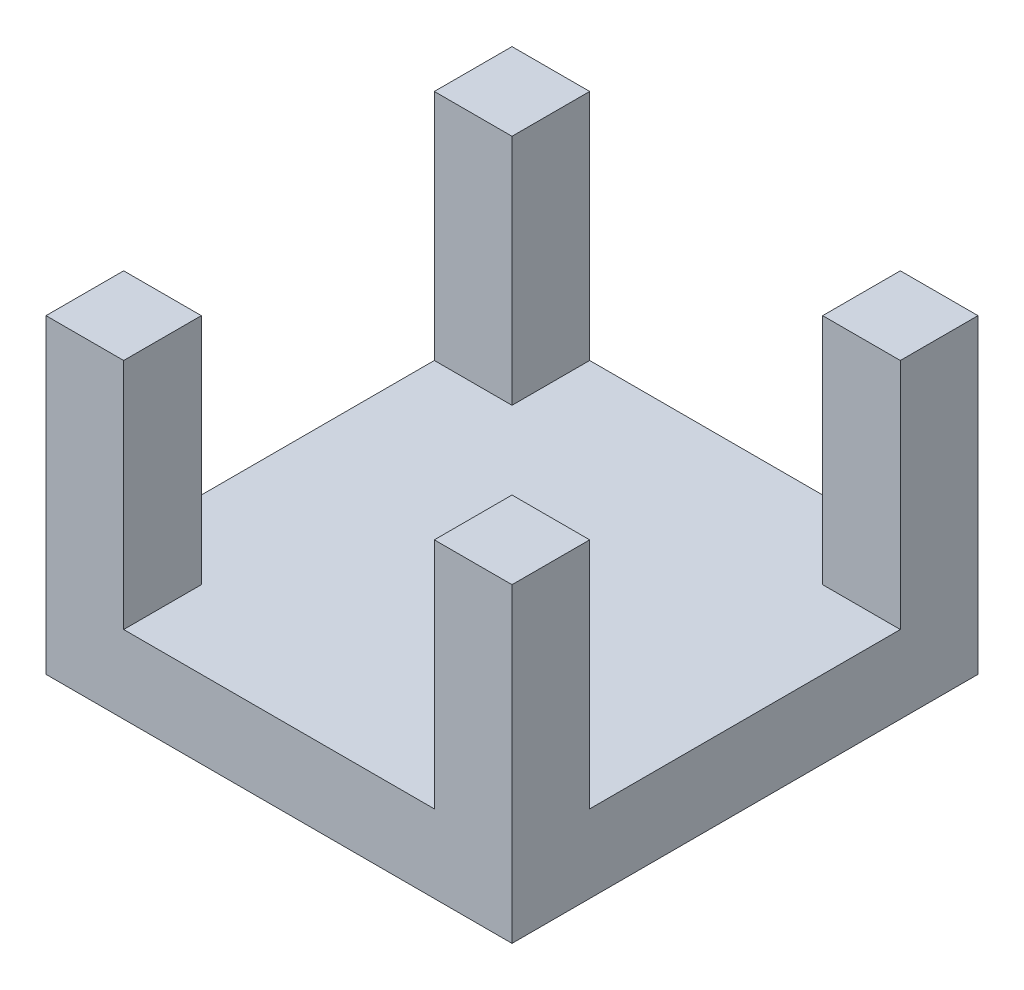
ISO-10303-21;
HEADER;
FILE_DESCRIPTION(('STEP AP214'),'2;1');
FILE_NAME('part.step','',(''),(''),'','','');
FILE_SCHEMA(('AUTOMOTIVE_DESIGN { 1 0 10303 214 1 1 1 1 }'));
ENDSEC;
DATA;
#1=APPLICATION_CONTEXT('core data for automotive mechanical design processes');
#2=APPLICATION_PROTOCOL_DEFINITION('international standard','automotive_design',2000,#1);
#3=PRODUCT_CONTEXT('',#1,'mechanical');
#4=PRODUCT('Part','Part','',(#3));
#5=PRODUCT_RELATED_PRODUCT_CATEGORY('part','',(#4));
#6=PRODUCT_DEFINITION_FORMATION('','',#4);
#7=PRODUCT_DEFINITION_CONTEXT('part definition',#1,'design');
#8=PRODUCT_DEFINITION('design','',#6,#7);
#9=PRODUCT_DEFINITION_SHAPE('','',#8);
#10=(LENGTH_UNIT() NAMED_UNIT(*) SI_UNIT(.MILLI.,.METRE.));
#11=(NAMED_UNIT(*) PLANE_ANGLE_UNIT() SI_UNIT($,.RADIAN.));
#12=(NAMED_UNIT(*) SI_UNIT($,.STERADIAN.) SOLID_ANGLE_UNIT());
#13=UNCERTAINTY_MEASURE_WITH_UNIT(LENGTH_MEASURE(1.E-05),#10,'distance_accuracy_value','');
#14=(GEOMETRIC_REPRESENTATION_CONTEXT(3) GLOBAL_UNCERTAINTY_ASSIGNED_CONTEXT((#13)) GLOBAL_UNIT_ASSIGNED_CONTEXT((#10,
#11,#12)) REPRESENTATION_CONTEXT('',''));
#15=CARTESIAN_POINT('',(0.,0.,0.));
#16=DIRECTION('',(0.,0.,1.));
#17=DIRECTION('',(1.,0.,0.));
#18=AXIS2_PLACEMENT_3D('',#15,#16,#17);
#19=CARTESIAN_POINT('',(0.,400.,0.));
#20=DIRECTION('',(0.,1.,0.));
#21=DIRECTION('',(0.,0.,1.));
#22=AXIS2_PLACEMENT_3D('',#19,#20,#21);
#23=PLANE('',#22);
#24=DIRECTION('',(-1.,0.,0.));
#25=VECTOR('',#24,1.);
#26=CARTESIAN_POINT('',(-500.,400.,-200.));
#27=LINE('',#26,#25);
#28=CARTESIAN_POINT('',(-200.,400.,-200.));
#29=VERTEX_POINT('',#28);
#30=CARTESIAN_POINT('',(-300.,400.,-200.));
#31=VERTEX_POINT('',#30);
#32=EDGE_CURVE('E181',#29,#31,#27,.T.);
#33=ORIENTED_EDGE('',*,*,#32,.F.);
#34=DIRECTION('',(0.,0.,1.));
#35=VECTOR('',#34,1.);
#36=CARTESIAN_POINT('',(-200.,400.,0.));
#37=LINE('',#36,#35);
#38=CARTESIAN_POINT('',(-200.,400.,-300.));
#39=VERTEX_POINT('',#38);
#40=EDGE_CURVE('E328',#39,#29,#37,.T.);
#41=ORIENTED_EDGE('',*,*,#40,.F.);
#42=DIRECTION('',(-1.,0.,0.));
#43=VECTOR('',#42,1.);
#44=CARTESIAN_POINT('',(-300.,400.,-300.));
#45=LINE('',#44,#43);
#46=CARTESIAN_POINT('',(-300.,400.,-300.));
#47=VERTEX_POINT('',#46);
#48=EDGE_CURVE('E70',#39,#47,#45,.T.);
#49=ORIENTED_EDGE('',*,*,#48,.T.);
#50=DIRECTION('',(0.,0.,1.));
#51=VECTOR('',#50,1.);
#52=CARTESIAN_POINT('',(-300.,400.,-300.));
#53=LINE('',#52,#51);
#54=EDGE_CURVE('E280',#47,#31,#53,.T.);
#55=ORIENTED_EDGE('',*,*,#54,.T.);
#56=EDGE_LOOP('',(#33,#41,#49,#55));
#57=FACE_BOUND('',#56,.T.);
#58=ADVANCED_FACE('F45',(#57),#23,.T.);
#59=DIRECTION('',(0.,0.,-1.));
#60=VECTOR('',#59,1.);
#61=CARTESIAN_POINT('',(200.,400.,-500.));
#62=LINE('',#61,#60);
#63=CARTESIAN_POINT('',(200.,400.,-200.));
#64=VERTEX_POINT('',#63);
#65=CARTESIAN_POINT('',(200.,400.,-300.));
#66=VERTEX_POINT('',#65);
#67=EDGE_CURVE('E227',#64,#66,#62,.T.);
#68=ORIENTED_EDGE('',*,*,#67,.F.);
#69=DIRECTION('',(-1.,0.,0.));
#70=VECTOR('',#69,1.);
#71=CARTESIAN_POINT('',(0.,400.,-200.));
#72=LINE('',#71,#70);
#73=CARTESIAN_POINT('',(300.,400.,-200.));
#74=VERTEX_POINT('',#73);
#75=EDGE_CURVE('E325',#74,#64,#72,.T.);
#76=ORIENTED_EDGE('',*,*,#75,.F.);
#77=DIRECTION('',(0.,0.,-1.));
#78=VECTOR('',#77,1.);
#79=CARTESIAN_POINT('',(300.,400.,-300.));
#80=LINE('',#79,#78);
#81=CARTESIAN_POINT('',(300.,400.,-300.));
#82=VERTEX_POINT('',#81);
#83=EDGE_CURVE('E287',#74,#82,#80,.T.);
#84=ORIENTED_EDGE('',*,*,#83,.T.);
#85=EDGE_CURVE('E292',#82,#66,#45,.T.);
#86=ORIENTED_EDGE('',*,*,#85,.T.);
#87=EDGE_LOOP('',(#68,#76,#84,#86));
#88=FACE_BOUND('',#87,.T.);
#89=ADVANCED_FACE('F373',(#88),#23,.T.);
#90=DIRECTION('',(1.,0.,0.));
#91=VECTOR('',#90,1.);
#92=CARTESIAN_POINT('',(200.,400.,200.));
#93=LINE('',#92,#91);
#94=CARTESIAN_POINT('',(200.,400.,200.));
#95=VERTEX_POINT('',#94);
#96=CARTESIAN_POINT('',(300.,400.,200.));
#97=VERTEX_POINT('',#96);
#98=EDGE_CURVE('E223',#95,#97,#93,.T.);
#99=ORIENTED_EDGE('',*,*,#98,.F.);
#100=DIRECTION('',(0.,0.,-1.));
#101=VECTOR('',#100,1.);
#102=CARTESIAN_POINT('',(200.,400.,0.));
#103=LINE('',#102,#101);
#104=CARTESIAN_POINT('',(200.,400.,300.));
#105=VERTEX_POINT('',#104);
#106=EDGE_CURVE('E322',#105,#95,#103,.T.);
#107=ORIENTED_EDGE('',*,*,#106,.F.);
#108=DIRECTION('',(1.,0.,0.));
#109=VECTOR('',#108,1.);
#110=CARTESIAN_POINT('',(-300.,400.,300.));
#111=LINE('',#110,#109);
#112=CARTESIAN_POINT('',(300.,400.,300.));
#113=VERTEX_POINT('',#112);
#114=EDGE_CURVE('E283',#105,#113,#111,.T.);
#115=ORIENTED_EDGE('',*,*,#114,.T.);
#116=EDGE_CURVE('E288',#113,#97,#80,.T.);
#117=ORIENTED_EDGE('',*,*,#116,.T.);
#118=EDGE_LOOP('',(#99,#107,#115,#117));
#119=FACE_BOUND('',#118,.T.);
#120=ADVANCED_FACE('F378',(#119),#23,.T.);
#121=CARTESIAN_POINT('',(-300.,400.,-300.));
#122=DIRECTION('',(1.,0.,0.));
#123=DIRECTION('',(0.,0.,-1.));
#124=AXIS2_PLACEMENT_3D('',#121,#122,#123);
#125=PLANE('',#124);
#126=DIRECTION('',(0.,0.,1.));
#127=VECTOR('',#126,1.);
#128=CARTESIAN_POINT('',(-300.,100.,-300.));
#129=LINE('',#128,#127);
#130=CARTESIAN_POINT('',(-300.,100.,-200.));
#131=VERTEX_POINT('',#130);
#132=CARTESIAN_POINT('',(-300.,100.,200.));
#133=VERTEX_POINT('',#132);
#134=EDGE_CURVE('E179',#131,#133,#129,.T.);
#135=ORIENTED_EDGE('',*,*,#134,.F.);
#136=DIRECTION('',(0.,1.,0.));
#137=VECTOR('',#136,1.);
#138=CARTESIAN_POINT('',(-300.,400.,-200.));
#139=LINE('',#138,#137);
#140=EDGE_CURVE('E267',#131,#31,#139,.T.);
#141=ORIENTED_EDGE('',*,*,#140,.T.);
#142=ORIENTED_EDGE('',*,*,#54,.F.);
#143=DIRECTION('',(0.,-1.,0.));
#144=VECTOR('',#143,1.);
#145=CARTESIAN_POINT('',(-300.,400.,-300.));
#146=LINE('',#145,#144);
#147=CARTESIAN_POINT('',(-300.,0.,-300.));
#148=VERTEX_POINT('',#147);
#149=EDGE_CURVE('E296',#47,#148,#146,.T.);
#150=ORIENTED_EDGE('',*,*,#149,.T.);
#151=DIRECTION('',(0.,0.,1.));
#152=VECTOR('',#151,1.);
#153=CARTESIAN_POINT('',(-300.,0.,-300.));
#154=LINE('',#153,#152);
#155=CARTESIAN_POINT('',(-300.,0.,300.));
#156=VERTEX_POINT('',#155);
#157=EDGE_CURVE('E279',#148,#156,#154,.T.);
#158=ORIENTED_EDGE('',*,*,#157,.T.);
#159=DIRECTION('',(0.,-1.,0.));
#160=VECTOR('',#159,1.);
#161=CARTESIAN_POINT('',(-300.,400.,300.));
#162=LINE('',#161,#160);
#163=CARTESIAN_POINT('',(-300.,400.,300.));
#164=VERTEX_POINT('',#163);
#165=EDGE_CURVE('E316',#164,#156,#162,.T.);
#166=ORIENTED_EDGE('',*,*,#165,.F.);
#167=CARTESIAN_POINT('',(-300.,400.,200.));
#168=VERTEX_POINT('',#167);
#169=EDGE_CURVE('E99',#168,#164,#53,.T.);
#170=ORIENTED_EDGE('',*,*,#169,.F.);
#171=DIRECTION('',(0.,-1.,0.));
#172=VECTOR('',#171,1.);
#173=CARTESIAN_POINT('',(-300.,400.,200.));
#174=LINE('',#173,#172);
#175=EDGE_CURVE('E61',#168,#133,#174,.T.);
#176=ORIENTED_EDGE('',*,*,#175,.T.);
#177=EDGE_LOOP('',(#135,#141,#142,#150,#158,#166,#170,#176));
#178=FACE_BOUND('',#177,.T.);
#179=ADVANCED_FACE('F47',(#178),#125,.F.);
#180=CARTESIAN_POINT('',(-300.,400.,300.));
#181=DIRECTION('',(0.,0.,-1.));
#182=DIRECTION('',(-1.,0.,0.));
#183=AXIS2_PLACEMENT_3D('',#180,#181,#182);
#184=PLANE('',#183);
#185=ORIENTED_EDGE('',*,*,#114,.F.);
#186=DIRECTION('',(0.,-1.,0.));
#187=VECTOR('',#186,1.);
#188=CARTESIAN_POINT('',(200.,400.,300.));
#189=LINE('',#188,#187);
#190=CARTESIAN_POINT('',(200.,100.,300.));
#191=VERTEX_POINT('',#190);
#192=EDGE_CURVE('E247',#105,#191,#189,.T.);
#193=ORIENTED_EDGE('',*,*,#192,.T.);
#194=DIRECTION('',(1.,0.,0.));
#195=VECTOR('',#194,1.);
#196=CARTESIAN_POINT('',(-300.,100.,300.));
#197=LINE('',#196,#195);
#198=CARTESIAN_POINT('',(-200.,100.,300.));
#199=VERTEX_POINT('',#198);
#200=EDGE_CURVE('E274',#199,#191,#197,.T.);
#201=ORIENTED_EDGE('',*,*,#200,.F.);
#202=DIRECTION('',(0.,1.,0.));
#203=VECTOR('',#202,1.);
#204=CARTESIAN_POINT('',(-200.,400.,300.));
#205=LINE('',#204,#203);
#206=CARTESIAN_POINT('',(-200.,400.,300.));
#207=VERTEX_POINT('',#206);
#208=EDGE_CURVE('E195',#199,#207,#205,.T.);
#209=ORIENTED_EDGE('',*,*,#208,.T.);
#210=EDGE_CURVE('E284',#164,#207,#111,.T.);
#211=ORIENTED_EDGE('',*,*,#210,.F.);
#212=ORIENTED_EDGE('',*,*,#165,.T.);
#213=DIRECTION('',(1.,0.,0.));
#214=VECTOR('',#213,1.);
#215=CARTESIAN_POINT('',(-300.,0.,300.));
#216=LINE('',#215,#214);
#217=CARTESIAN_POINT('',(300.,0.,300.));
#218=VERTEX_POINT('',#217);
#219=EDGE_CURVE('E299',#156,#218,#216,.T.);
#220=ORIENTED_EDGE('',*,*,#219,.T.);
#221=DIRECTION('',(0.,-1.,0.));
#222=VECTOR('',#221,1.);
#223=CARTESIAN_POINT('',(300.,400.,300.));
#224=LINE('',#223,#222);
#225=EDGE_CURVE('E312',#113,#218,#224,.T.);
#226=ORIENTED_EDGE('',*,*,#225,.F.);
#227=EDGE_LOOP('',(#185,#193,#201,#209,#211,#212,#220,#226));
#228=FACE_BOUND('',#227,.T.);
#229=ADVANCED_FACE('F393',(#228),#184,.F.);
#230=CARTESIAN_POINT('',(300.,400.,-300.));
#231=DIRECTION('',(-1.,0.,0.));
#232=DIRECTION('',(0.,0.,1.));
#233=AXIS2_PLACEMENT_3D('',#230,#231,#232);
#234=PLANE('',#233);
#235=ORIENTED_EDGE('',*,*,#83,.F.);
#236=DIRECTION('',(0.,-1.,0.));
#237=VECTOR('',#236,1.);
#238=CARTESIAN_POINT('',(300.,400.,-200.));
#239=LINE('',#238,#237);
#240=CARTESIAN_POINT('',(300.,100.,-200.));
#241=VERTEX_POINT('',#240);
#242=EDGE_CURVE('E255',#74,#241,#239,.T.);
#243=ORIENTED_EDGE('',*,*,#242,.T.);
#244=DIRECTION('',(0.,0.,-1.));
#245=VECTOR('',#244,1.);
#246=CARTESIAN_POINT('',(300.,100.,-300.));
#247=LINE('',#246,#245);
#248=CARTESIAN_POINT('',(300.,100.,200.));
#249=VERTEX_POINT('',#248);
#250=EDGE_CURVE('E271',#249,#241,#247,.T.);
#251=ORIENTED_EDGE('',*,*,#250,.F.);
#252=DIRECTION('',(0.,1.,0.));
#253=VECTOR('',#252,1.);
#254=CARTESIAN_POINT('',(300.,400.,200.));
#255=LINE('',#254,#253);
#256=EDGE_CURVE('E251',#249,#97,#255,.T.);
#257=ORIENTED_EDGE('',*,*,#256,.T.);
#258=ORIENTED_EDGE('',*,*,#116,.F.);
#259=ORIENTED_EDGE('',*,*,#225,.T.);
#260=DIRECTION('',(0.,0.,-1.));
#261=VECTOR('',#260,1.);
#262=CARTESIAN_POINT('',(300.,0.,-300.));
#263=LINE('',#262,#261);
#264=CARTESIAN_POINT('',(300.,0.,-300.));
#265=VERTEX_POINT('',#264);
#266=EDGE_CURVE('E302',#218,#265,#263,.T.);
#267=ORIENTED_EDGE('',*,*,#266,.T.);
#268=DIRECTION('',(0.,-1.,0.));
#269=VECTOR('',#268,1.);
#270=CARTESIAN_POINT('',(300.,400.,-300.));
#271=LINE('',#270,#269);
#272=EDGE_CURVE('E309',#82,#265,#271,.T.);
#273=ORIENTED_EDGE('',*,*,#272,.F.);
#274=EDGE_LOOP('',(#235,#243,#251,#257,#258,#259,#267,#273));
#275=FACE_BOUND('',#274,.T.);
#276=ADVANCED_FACE('F387',(#275),#234,.F.);
#277=CARTESIAN_POINT('',(-300.,400.,-300.));
#278=DIRECTION('',(0.,0.,1.));
#279=DIRECTION('',(1.,0.,0.));
#280=AXIS2_PLACEMENT_3D('',#277,#278,#279);
#281=PLANE('',#280);
#282=ORIENTED_EDGE('',*,*,#48,.F.);
#283=DIRECTION('',(0.,-1.,0.));
#284=VECTOR('',#283,1.);
#285=CARTESIAN_POINT('',(-200.,400.,-300.));
#286=LINE('',#285,#284);
#287=CARTESIAN_POINT('',(-200.,100.,-300.));
#288=VERTEX_POINT('',#287);
#289=EDGE_CURVE('E263',#39,#288,#286,.T.);
#290=ORIENTED_EDGE('',*,*,#289,.T.);
#291=DIRECTION('',(-1.,0.,0.));
#292=VECTOR('',#291,1.);
#293=CARTESIAN_POINT('',(-300.,100.,-300.));
#294=LINE('',#293,#292);
#295=CARTESIAN_POINT('',(200.,100.,-300.));
#296=VERTEX_POINT('',#295);
#297=EDGE_CURVE('E54',#296,#288,#294,.T.);
#298=ORIENTED_EDGE('',*,*,#297,.F.);
#299=DIRECTION('',(0.,1.,0.));
#300=VECTOR('',#299,1.);
#301=CARTESIAN_POINT('',(200.,400.,-300.));
#302=LINE('',#301,#300);
#303=EDGE_CURVE('E259',#296,#66,#302,.T.);
#304=ORIENTED_EDGE('',*,*,#303,.T.);
#305=ORIENTED_EDGE('',*,*,#85,.F.);
#306=ORIENTED_EDGE('',*,*,#272,.T.);
#307=DIRECTION('',(-1.,0.,0.));
#308=VECTOR('',#307,1.);
#309=CARTESIAN_POINT('',(-300.,0.,-300.));
#310=LINE('',#309,#308);
#311=EDGE_CURVE('E92',#265,#148,#310,.T.);
#312=ORIENTED_EDGE('',*,*,#311,.T.);
#313=ORIENTED_EDGE('',*,*,#149,.F.);
#314=EDGE_LOOP('',(#282,#290,#298,#304,#305,#306,#312,#313));
#315=FACE_BOUND('',#314,.T.);
#316=ADVANCED_FACE('F339',(#315),#281,.F.);
#317=DIRECTION('',(0.,0.,1.));
#318=VECTOR('',#317,1.);
#319=CARTESIAN_POINT('',(-200.,400.,200.));
#320=LINE('',#319,#318);
#321=CARTESIAN_POINT('',(-200.,400.,200.));
#322=VERTEX_POINT('',#321);
#323=EDGE_CURVE('E220',#322,#207,#320,.T.);
#324=ORIENTED_EDGE('',*,*,#323,.F.);
#325=DIRECTION('',(1.,0.,0.));
#326=VECTOR('',#325,1.);
#327=CARTESIAN_POINT('',(0.,400.,200.));
#328=LINE('',#327,#326);
#329=EDGE_CURVE('E186',#168,#322,#328,.T.);
#330=ORIENTED_EDGE('',*,*,#329,.F.);
#331=ORIENTED_EDGE('',*,*,#169,.T.);
#332=ORIENTED_EDGE('',*,*,#210,.T.);
#333=EDGE_LOOP('',(#324,#330,#331,#332));
#334=FACE_BOUND('',#333,.T.);
#335=ADVANCED_FACE('F375',(#334),#23,.T.);
#336=CARTESIAN_POINT('',(0.,0.,0.));
#337=DIRECTION('',(0.,1.,0.));
#338=DIRECTION('',(0.,0.,1.));
#339=AXIS2_PLACEMENT_3D('',#336,#337,#338);
#340=PLANE('',#339);
#341=CARTESIAN_POINT('',(0.,0.,-200.));
#342=DIRECTION('',(0.,1.,0.));
#343=DIRECTION('',(0.,0.,1.));
#344=AXIS2_PLACEMENT_3D('',#341,#342,#343);
#345=CIRCLE('',#344,60.);
#346=CARTESIAN_POINT('',(0.,0.,-140.));
#347=VERTEX_POINT('',#346);
#348=EDGE_CURVE('E11',#347,#347,#345,.F.);
#349=ORIENTED_EDGE('',*,*,#348,.F.);
#350=EDGE_LOOP('',(#349));
#351=FACE_BOUND('',#350,.T.);
#352=ORIENTED_EDGE('',*,*,#157,.F.);
#353=ORIENTED_EDGE('',*,*,#311,.F.);
#354=ORIENTED_EDGE('',*,*,#266,.F.);
#355=ORIENTED_EDGE('',*,*,#219,.F.);
#356=EDGE_LOOP('',(#352,#353,#354,#355));
#357=FACE_BOUND('',#356,.T.);
#358=ADVANCED_FACE('F367',(#351,#357),#340,.F.);
#359=CARTESIAN_POINT('',(0.,100.,0.));
#360=DIRECTION('',(0.,1.,0.));
#361=DIRECTION('',(0.,0.,1.));
#362=AXIS2_PLACEMENT_3D('',#359,#360,#361);
#363=PLANE('',#362);
#364=ORIENTED_EDGE('',*,*,#134,.T.);
#365=DIRECTION('',(1.,0.,0.));
#366=VECTOR('',#365,1.);
#367=CARTESIAN_POINT('',(-500.,100.,200.));
#368=LINE('',#367,#366);
#369=CARTESIAN_POINT('',(-200.,100.,200.));
#370=VERTEX_POINT('',#369);
#371=EDGE_CURVE('E171',#133,#370,#368,.T.);
#372=ORIENTED_EDGE('',*,*,#371,.T.);
#373=DIRECTION('',(0.,0.,1.));
#374=VECTOR('',#373,1.);
#375=CARTESIAN_POINT('',(-200.,100.,200.));
#376=LINE('',#375,#374);
#377=EDGE_CURVE('E175',#370,#199,#376,.T.);
#378=ORIENTED_EDGE('',*,*,#377,.T.);
#379=ORIENTED_EDGE('',*,*,#200,.T.);
#380=DIRECTION('',(0.,0.,-1.));
#381=VECTOR('',#380,1.);
#382=CARTESIAN_POINT('',(200.,100.,200.));
#383=LINE('',#382,#381);
#384=CARTESIAN_POINT('',(200.,100.,200.));
#385=VERTEX_POINT('',#384);
#386=EDGE_CURVE('E197',#191,#385,#383,.T.);
#387=ORIENTED_EDGE('',*,*,#386,.T.);
#388=DIRECTION('',(1.,0.,0.));
#389=VECTOR('',#388,1.);
#390=CARTESIAN_POINT('',(200.,100.,200.));
#391=LINE('',#390,#389);
#392=EDGE_CURVE('E201',#385,#249,#391,.T.);
#393=ORIENTED_EDGE('',*,*,#392,.T.);
#394=ORIENTED_EDGE('',*,*,#250,.T.);
#395=DIRECTION('',(-1.,0.,0.));
#396=VECTOR('',#395,1.);
#397=CARTESIAN_POINT('',(200.,100.,-200.));
#398=LINE('',#397,#396);
#399=CARTESIAN_POINT('',(200.,100.,-200.));
#400=VERTEX_POINT('',#399);
#401=EDGE_CURVE('E208',#241,#400,#398,.T.);
#402=ORIENTED_EDGE('',*,*,#401,.T.);
#403=DIRECTION('',(0.,0.,-1.));
#404=VECTOR('',#403,1.);
#405=CARTESIAN_POINT('',(200.,100.,-500.));
#406=LINE('',#405,#404);
#407=EDGE_CURVE('E211',#400,#296,#406,.T.);
#408=ORIENTED_EDGE('',*,*,#407,.T.);
#409=ORIENTED_EDGE('',*,*,#297,.T.);
#410=DIRECTION('',(0.,0.,1.));
#411=VECTOR('',#410,1.);
#412=CARTESIAN_POINT('',(-200.,100.,-500.));
#413=LINE('',#412,#411);
#414=CARTESIAN_POINT('',(-200.,100.,-200.));
#415=VERTEX_POINT('',#414);
#416=EDGE_CURVE('E215',#288,#415,#413,.T.);
#417=ORIENTED_EDGE('',*,*,#416,.T.);
#418=DIRECTION('',(-1.,0.,0.));
#419=VECTOR('',#418,1.);
#420=CARTESIAN_POINT('',(-500.,100.,-200.));
#421=LINE('',#420,#419);
#422=EDGE_CURVE('E191',#415,#131,#421,.T.);
#423=ORIENTED_EDGE('',*,*,#422,.T.);
#424=EDGE_LOOP('',(#364,#372,#378,#379,#387,#393,#394,#402,#408,#409,#417,#423));
#425=FACE_BOUND('',#424,.T.);
#426=ADVANCED_FACE('F173',(#425),#363,.T.);
#427=CARTESIAN_POINT('',(-500.,100.,-200.));
#428=DIRECTION('',(0.,0.,-1.));
#429=DIRECTION('',(-1.,0.,0.));
#430=AXIS2_PLACEMENT_3D('',#427,#428,#429);
#431=PLANE('',#430);
#432=ORIENTED_EDGE('',*,*,#422,.F.);
#433=DIRECTION('',(0.,1.,0.));
#434=VECTOR('',#433,1.);
#435=CARTESIAN_POINT('',(-200.,100.,-200.));
#436=LINE('',#435,#434);
#437=EDGE_CURVE('E232',#415,#29,#436,.T.);
#438=ORIENTED_EDGE('',*,*,#437,.T.);
#439=ORIENTED_EDGE('',*,*,#32,.T.);
#440=ORIENTED_EDGE('',*,*,#140,.F.);
#441=EDGE_LOOP('',(#432,#438,#439,#440));
#442=FACE_BOUND('',#441,.T.);
#443=ADVANCED_FACE('F421',(#442),#431,.F.);
#444=CARTESIAN_POINT('',(-200.,100.,-500.));
#445=DIRECTION('',(-1.,0.,0.));
#446=DIRECTION('',(0.,0.,1.));
#447=AXIS2_PLACEMENT_3D('',#444,#445,#446);
#448=PLANE('',#447);
#449=ORIENTED_EDGE('',*,*,#40,.T.);
#450=ORIENTED_EDGE('',*,*,#437,.F.);
#451=ORIENTED_EDGE('',*,*,#416,.F.);
#452=ORIENTED_EDGE('',*,*,#289,.F.);
#453=EDGE_LOOP('',(#449,#450,#451,#452));
#454=FACE_BOUND('',#453,.T.);
#455=ADVANCED_FACE('F337',(#454),#448,.F.);
#456=CARTESIAN_POINT('',(200.,100.,-500.));
#457=DIRECTION('',(1.,0.,0.));
#458=DIRECTION('',(0.,0.,-1.));
#459=AXIS2_PLACEMENT_3D('',#456,#457,#458);
#460=PLANE('',#459);
#461=ORIENTED_EDGE('',*,*,#407,.F.);
#462=DIRECTION('',(0.,1.,0.));
#463=VECTOR('',#462,1.);
#464=CARTESIAN_POINT('',(200.,100.,-200.));
#465=LINE('',#464,#463);
#466=EDGE_CURVE('E236',#400,#64,#465,.T.);
#467=ORIENTED_EDGE('',*,*,#466,.T.);
#468=ORIENTED_EDGE('',*,*,#67,.T.);
#469=ORIENTED_EDGE('',*,*,#303,.F.);
#470=EDGE_LOOP('',(#461,#467,#468,#469));
#471=FACE_BOUND('',#470,.T.);
#472=ADVANCED_FACE('F413',(#471),#460,.F.);
#473=CARTESIAN_POINT('',(200.,100.,-200.));
#474=DIRECTION('',(0.,0.,-1.));
#475=DIRECTION('',(-1.,0.,0.));
#476=AXIS2_PLACEMENT_3D('',#473,#474,#475);
#477=PLANE('',#476);
#478=ORIENTED_EDGE('',*,*,#75,.T.);
#479=ORIENTED_EDGE('',*,*,#466,.F.);
#480=ORIENTED_EDGE('',*,*,#401,.F.);
#481=ORIENTED_EDGE('',*,*,#242,.F.);
#482=EDGE_LOOP('',(#478,#479,#480,#481));
#483=FACE_BOUND('',#482,.T.);
#484=ADVANCED_FACE('F409',(#483),#477,.F.);
#485=CARTESIAN_POINT('',(200.,100.,200.));
#486=DIRECTION('',(0.,0.,1.));
#487=DIRECTION('',(1.,0.,0.));
#488=AXIS2_PLACEMENT_3D('',#485,#486,#487);
#489=PLANE('',#488);
#490=ORIENTED_EDGE('',*,*,#392,.F.);
#491=DIRECTION('',(0.,1.,0.));
#492=VECTOR('',#491,1.);
#493=CARTESIAN_POINT('',(200.,100.,200.));
#494=LINE('',#493,#492);
#495=EDGE_CURVE('E190',#385,#95,#494,.T.);
#496=ORIENTED_EDGE('',*,*,#495,.T.);
#497=ORIENTED_EDGE('',*,*,#98,.T.);
#498=ORIENTED_EDGE('',*,*,#256,.F.);
#499=EDGE_LOOP('',(#490,#496,#497,#498));
#500=FACE_BOUND('',#499,.T.);
#501=ADVANCED_FACE('F401',(#500),#489,.F.);
#502=CARTESIAN_POINT('',(200.,100.,200.));
#503=DIRECTION('',(1.,0.,0.));
#504=DIRECTION('',(0.,0.,-1.));
#505=AXIS2_PLACEMENT_3D('',#502,#503,#504);
#506=PLANE('',#505);
#507=ORIENTED_EDGE('',*,*,#106,.T.);
#508=ORIENTED_EDGE('',*,*,#495,.F.);
#509=ORIENTED_EDGE('',*,*,#386,.F.);
#510=ORIENTED_EDGE('',*,*,#192,.F.);
#511=EDGE_LOOP('',(#507,#508,#509,#510));
#512=FACE_BOUND('',#511,.T.);
#513=ADVANCED_FACE('F437',(#512),#506,.F.);
#514=CARTESIAN_POINT('',(-200.,100.,200.));
#515=DIRECTION('',(-1.,0.,0.));
#516=DIRECTION('',(0.,0.,1.));
#517=AXIS2_PLACEMENT_3D('',#514,#515,#516);
#518=PLANE('',#517);
#519=ORIENTED_EDGE('',*,*,#377,.F.);
#520=DIRECTION('',(0.,1.,0.));
#521=VECTOR('',#520,1.);
#522=CARTESIAN_POINT('',(-200.,100.,200.));
#523=LINE('',#522,#521);
#524=EDGE_CURVE('E184',#370,#322,#523,.T.);
#525=ORIENTED_EDGE('',*,*,#524,.T.);
#526=ORIENTED_EDGE('',*,*,#323,.T.);
#527=ORIENTED_EDGE('',*,*,#208,.F.);
#528=EDGE_LOOP('',(#519,#525,#526,#527));
#529=FACE_BOUND('',#528,.T.);
#530=ADVANCED_FACE('F193',(#529),#518,.F.);
#531=CARTESIAN_POINT('',(-500.,100.,200.));
#532=DIRECTION('',(0.,0.,1.));
#533=DIRECTION('',(1.,0.,0.));
#534=AXIS2_PLACEMENT_3D('',#531,#532,#533);
#535=PLANE('',#534);
#536=ORIENTED_EDGE('',*,*,#329,.T.);
#537=ORIENTED_EDGE('',*,*,#524,.F.);
#538=ORIENTED_EDGE('',*,*,#371,.F.);
#539=ORIENTED_EDGE('',*,*,#175,.F.);
#540=EDGE_LOOP('',(#536,#537,#538,#539));
#541=FACE_BOUND('',#540,.T.);
#542=ADVANCED_FACE('F185',(#541),#535,.F.);
#543=CARTESIAN_POINT('',(0.,-10.,-200.));
#544=DIRECTION('',(0.,-1.,0.));
#545=DIRECTION('',(0.,0.,-1.));
#546=AXIS2_PLACEMENT_3D('',#543,#544,#545);
#547=PLANE('',#546);
#548=CARTESIAN_POINT('',(0.,-10.,-200.));
#549=DIRECTION('',(0.,-1.,0.));
#550=DIRECTION('',(0.,0.,-1.));
#551=AXIS2_PLACEMENT_3D('',#548,#549,#550);
#552=CIRCLE('',#551,60.);
#553=CARTESIAN_POINT('',(0.,-10.,-260.));
#554=VERTEX_POINT('',#553);
#555=EDGE_CURVE('E224',#554,#554,#552,.T.);
#556=ORIENTED_EDGE('',*,*,#555,.T.);
#557=EDGE_LOOP('',(#556));
#558=FACE_BOUND('',#557,.T.);
#559=CARTESIAN_POINT('',(0.,-10.,-200.));
#560=DIRECTION('',(0.,-1.,0.));
#561=DIRECTION('',(0.,0.,-1.));
#562=AXIS2_PLACEMENT_3D('',#559,#560,#561);
#563=CIRCLE('',#562,50.);
#564=CARTESIAN_POINT('',(0.,-10.,-250.));
#565=VERTEX_POINT('',#564);
#566=EDGE_CURVE('E344',#565,#565,#563,.T.);
#567=ORIENTED_EDGE('',*,*,#566,.F.);
#568=EDGE_LOOP('',(#567));
#569=FACE_BOUND('',#568,.T.);
#570=ADVANCED_FACE('F368',(#558,#569),#547,.T.);
#571=CARTESIAN_POINT('',(0.,-10.,-200.));
#572=DIRECTION('',(0.,1.,0.));
#573=DIRECTION('',(0.,0.,1.));
#574=AXIS2_PLACEMENT_3D('',#571,#572,#573);
#575=CYLINDRICAL_SURFACE('',#574,60.);
#576=ORIENTED_EDGE('',*,*,#555,.F.);
#577=EDGE_LOOP('',(#576));
#578=FACE_BOUND('',#577,.T.);
#579=ORIENTED_EDGE('',*,*,#348,.T.);
#580=EDGE_LOOP('',(#579));
#581=FACE_BOUND('',#580,.T.);
#582=ADVANCED_FACE('F361',(#578,#581),#575,.T.);
#583=CARTESIAN_POINT('',(0.,-10.,-200.));
#584=DIRECTION('',(0.,1.,0.));
#585=DIRECTION('',(0.,0.,1.));
#586=AXIS2_PLACEMENT_3D('',#583,#584,#585);
#587=CYLINDRICAL_SURFACE('',#586,50.);
#588=ORIENTED_EDGE('',*,*,#566,.T.);
#589=EDGE_LOOP('',(#588));
#590=FACE_BOUND('',#589,.T.);
#591=CARTESIAN_POINT('',(0.,0.,-200.));
#592=DIRECTION('',(0.,-1.,0.));
#593=DIRECTION('',(0.,0.,-1.));
#594=AXIS2_PLACEMENT_3D('',#591,#592,#593);
#595=CIRCLE('',#594,50.);
#596=CARTESIAN_POINT('',(0.,0.,-250.));
#597=VERTEX_POINT('',#596);
#598=EDGE_CURVE('E348',#597,#597,#595,.T.);
#599=ORIENTED_EDGE('',*,*,#598,.F.);
#600=EDGE_LOOP('',(#599));
#601=FACE_BOUND('',#600,.T.);
#602=ADVANCED_FACE('F359',(#590,#601),#587,.F.);
#603=ORIENTED_EDGE('',*,*,#598,.T.);
#604=EDGE_LOOP('',(#603));
#605=FACE_BOUND('',#604,.T.);
#606=ADVANCED_FACE('F357',(#605),#340,.F.);
#607=CLOSED_SHELL('',(#58,#89,#120,#179,#229,#276,#316,#335,#358,#426,#443,#455,#472,#484,#501,
#513,#530,#542,#570,#582,#602,#606));
#608=MANIFOLD_SOLID_BREP('B2',#607);
#609=ADVANCED_BREP_SHAPE_REPRESENTATION('',(#18,#608),#14);
#610=SHAPE_DEFINITION_REPRESENTATION(#9,#609);
ENDSEC;
END-ISO-10303-21;
